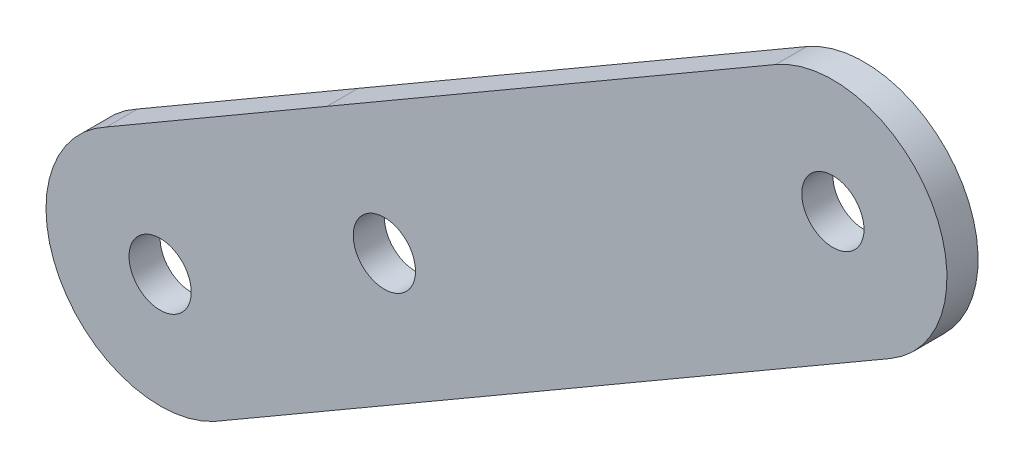
ISO-10303-21;
HEADER;
FILE_DESCRIPTION(('STEP AP214'),'2;1');
FILE_NAME('part.step','',(''),(''),'','','');
FILE_SCHEMA(('AUTOMOTIVE_DESIGN { 1 0 10303 214 1 1 1 1 }'));
ENDSEC;
DATA;
#1=APPLICATION_CONTEXT('core data for automotive mechanical design processes');
#2=APPLICATION_PROTOCOL_DEFINITION('international standard','automotive_design',2000,#1);
#3=PRODUCT_CONTEXT('',#1,'mechanical');
#4=PRODUCT('Part','Part','',(#3));
#5=PRODUCT_RELATED_PRODUCT_CATEGORY('part','',(#4));
#6=PRODUCT_DEFINITION_FORMATION('','',#4);
#7=PRODUCT_DEFINITION_CONTEXT('part definition',#1,'design');
#8=PRODUCT_DEFINITION('design','',#6,#7);
#9=PRODUCT_DEFINITION_SHAPE('','',#8);
#10=(LENGTH_UNIT() NAMED_UNIT(*) SI_UNIT(.MILLI.,.METRE.));
#11=(NAMED_UNIT(*) PLANE_ANGLE_UNIT() SI_UNIT($,.RADIAN.));
#12=(NAMED_UNIT(*) SI_UNIT($,.STERADIAN.) SOLID_ANGLE_UNIT());
#13=UNCERTAINTY_MEASURE_WITH_UNIT(LENGTH_MEASURE(1.E-05),#10,'distance_accuracy_value','');
#14=(GEOMETRIC_REPRESENTATION_CONTEXT(3) GLOBAL_UNCERTAINTY_ASSIGNED_CONTEXT((#13)) GLOBAL_UNIT_ASSIGNED_CONTEXT((#10,
#11,#12)) REPRESENTATION_CONTEXT('',''));
#15=CARTESIAN_POINT('',(0.,0.,0.));
#16=DIRECTION('',(0.,0.,1.));
#17=DIRECTION('',(1.,0.,0.));
#18=AXIS2_PLACEMENT_3D('',#15,#16,#17);
#19=CARTESIAN_POINT('',(72.6611774632217,-125.128113418005,3.));
#20=DIRECTION('',(-0.502167271742929,0.86477050781711,0.));
#21=DIRECTION('',(-0.86477050781711,-0.50216727174293,0.));
#22=AXIS2_PLACEMENT_3D('',#19,#20,#21);
#23=PLANE('',#22);
#24=DIRECTION('',(0.86477050781711,0.50216727174293,0.));
#25=VECTOR('',#24,1.);
#26=CARTESIAN_POINT('',(72.6611774632217,-125.128113418005,0.));
#27=LINE('',#26,#25);
#28=CARTESIAN_POINT('',(173.688379763338,-66.4621967473133,0.));
#29=VERTEX_POINT('',#28);
#30=CARTESIAN_POINT('',(216.929531332778,-41.352308153332,0.));
#31=VERTEX_POINT('',#30);
#32=EDGE_CURVE('E133',#29,#31,#27,.T.);
#33=ORIENTED_EDGE('',*,*,#32,.T.);
#34=DIRECTION('',(0.,0.,-1.));
#35=VECTOR('',#34,1.);
#36=CARTESIAN_POINT('',(216.929531332778,-41.352308153332,3.));
#37=LINE('',#36,#35);
#38=CARTESIAN_POINT('',(216.929531332778,-41.352308153332,3.));
#39=VERTEX_POINT('',#38);
#40=EDGE_CURVE('E11',#39,#31,#37,.T.);
#41=ORIENTED_EDGE('',*,*,#40,.F.);
#42=DIRECTION('',(0.86477050781711,0.50216727174293,0.));
#43=VECTOR('',#42,1.);
#44=CARTESIAN_POINT('',(72.6611774632217,-125.128113418005,3.));
#45=LINE('',#44,#43);
#46=CARTESIAN_POINT('',(173.688379763338,-66.4621967473133,3.));
#47=VERTEX_POINT('',#46);
#48=EDGE_CURVE('E158',#47,#39,#45,.T.);
#49=ORIENTED_EDGE('',*,*,#48,.F.);
#50=DIRECTION('',(0.,0.,-1.));
#51=VECTOR('',#50,1.);
#52=CARTESIAN_POINT('',(173.688379763338,-66.4621967473133,3.));
#53=LINE('',#52,#51);
#54=EDGE_CURVE('E123',#47,#29,#53,.T.);
#55=ORIENTED_EDGE('',*,*,#54,.T.);
#56=EDGE_LOOP('',(#33,#41,#49,#55));
#57=FACE_BOUND('',#56,.T.);
#58=ADVANCED_FACE('F39',(#57),#23,.F.);
#59=CARTESIAN_POINT('',(211.405691084948,-31.839832121915,3.));
#60=DIRECTION('',(0.,0.,-1.));
#61=DIRECTION('',(-1.,0.,0.));
#62=AXIS2_PLACEMENT_3D('',#59,#60,#61);
#63=CYLINDRICAL_SURFACE('',#62,11.0000005150832);
#64=CARTESIAN_POINT('',(211.405691084948,-31.839832121915,0.));
#65=DIRECTION('',(0.,0.,1.));
#66=DIRECTION('',(1.,0.,0.));
#67=AXIS2_PLACEMENT_3D('',#64,#65,#66);
#68=CIRCLE('',#67,11.0000005150832);
#69=CARTESIAN_POINT('',(205.881850837118,-22.327356090498,0.));
#70=VERTEX_POINT('',#69);
#71=EDGE_CURVE('E136',#31,#70,#68,.T.);
#72=ORIENTED_EDGE('',*,*,#71,.T.);
#73=DIRECTION('',(0.,0.,-1.));
#74=VECTOR('',#73,1.);
#75=CARTESIAN_POINT('',(205.881850837118,-22.327356090498,3.));
#76=LINE('',#75,#74);
#77=CARTESIAN_POINT('',(205.881850837118,-22.327356090498,3.));
#78=VERTEX_POINT('',#77);
#79=EDGE_CURVE('E48',#78,#70,#76,.T.);
#80=ORIENTED_EDGE('',*,*,#79,.F.);
#81=CARTESIAN_POINT('',(211.405691084948,-31.839832121915,3.));
#82=DIRECTION('',(0.,0.,1.));
#83=DIRECTION('',(1.,0.,0.));
#84=AXIS2_PLACEMENT_3D('',#81,#82,#83);
#85=CIRCLE('',#84,11.0000005150832);
#86=EDGE_CURVE('E92',#39,#78,#85,.T.);
#87=ORIENTED_EDGE('',*,*,#86,.F.);
#88=ORIENTED_EDGE('',*,*,#40,.T.);
#89=EDGE_LOOP('',(#72,#80,#87,#88));
#90=FACE_BOUND('',#89,.T.);
#91=ADVANCED_FACE('F151',(#90),#63,.T.);
#92=CARTESIAN_POINT('',(61.6134969675615,-106.103161355171,3.));
#93=DIRECTION('',(-0.50216727174293,0.86477050781711,0.));
#94=DIRECTION('',(-0.86477050781711,-0.50216727174293,0.));
#95=AXIS2_PLACEMENT_3D('',#92,#93,#94);
#96=PLANE('',#95);
#97=DIRECTION('',(0.86477050781711,0.50216727174293,0.));
#98=VECTOR('',#97,1.);
#99=CARTESIAN_POINT('',(61.6134969675615,-106.103161355171,0.));
#100=LINE('',#99,#98);
#101=CARTESIAN_POINT('',(162.640616578186,-47.4372927017925,0.));
#102=VERTEX_POINT('',#101);
#103=EDGE_CURVE('E139',#102,#70,#100,.T.);
#104=ORIENTED_EDGE('',*,*,#103,.F.);
#105=DIRECTION('',(0.,0.,-1.));
#106=VECTOR('',#105,1.);
#107=CARTESIAN_POINT('',(162.640616578186,-47.4372927017925,3.));
#108=LINE('',#107,#106);
#109=CARTESIAN_POINT('',(162.640616578186,-47.4372927017925,3.));
#110=VERTEX_POINT('',#109);
#111=EDGE_CURVE('E108',#110,#102,#108,.T.);
#112=ORIENTED_EDGE('',*,*,#111,.F.);
#113=DIRECTION('',(0.86477050781711,0.50216727174293,0.));
#114=VECTOR('',#113,1.);
#115=CARTESIAN_POINT('',(61.6134969675615,-106.103161355171,3.));
#116=LINE('',#115,#114);
#117=EDGE_CURVE('E117',#110,#78,#116,.T.);
#118=ORIENTED_EDGE('',*,*,#117,.T.);
#119=ORIENTED_EDGE('',*,*,#79,.T.);
#120=EDGE_LOOP('',(#104,#112,#118,#119));
#121=FACE_BOUND('',#120,.T.);
#122=ADVANCED_FACE('F150',(#121),#96,.T.);
#123=CARTESIAN_POINT('',(61.660434185085,-106.11437485163,3.));
#124=DIRECTION('',(-0.502413578957616,0.864627431717846,0.));
#125=DIRECTION('',(-0.864627431717847,-0.502413578957616,0.));
#126=AXIS2_PLACEMENT_3D('',#123,#124,#125);
#127=PLANE('',#126);
#128=DIRECTION('',(0.864627431717847,0.502413578957616,0.));
#129=VECTOR('',#128,1.);
#130=CARTESIAN_POINT('',(61.660434185085,-106.11437485163,0.));
#131=LINE('',#130,#129);
#132=CARTESIAN_POINT('',(141.367093536746,-59.7988098781007,0.));
#133=VERTEX_POINT('',#132);
#134=EDGE_CURVE('E107',#133,#102,#131,.T.);
#135=ORIENTED_EDGE('',*,*,#134,.F.);
#136=DIRECTION('',(0.,0.,-1.));
#137=VECTOR('',#136,1.);
#138=CARTESIAN_POINT('',(141.367093536746,-59.7988098781007,3.));
#139=LINE('',#138,#137);
#140=CARTESIAN_POINT('',(141.367093536746,-59.7988098781007,3.));
#141=VERTEX_POINT('',#140);
#142=EDGE_CURVE('E101',#141,#133,#139,.T.);
#143=ORIENTED_EDGE('',*,*,#142,.F.);
#144=DIRECTION('',(0.864627431717847,0.502413578957616,0.));
#145=VECTOR('',#144,1.);
#146=CARTESIAN_POINT('',(61.660434185085,-106.11437485163,3.));
#147=LINE('',#146,#145);
#148=EDGE_CURVE('E105',#141,#110,#147,.T.);
#149=ORIENTED_EDGE('',*,*,#148,.T.);
#150=ORIENTED_EDGE('',*,*,#111,.T.);
#151=EDGE_LOOP('',(#135,#143,#149,#150));
#152=FACE_BOUND('',#151,.T.);
#153=ADVANCED_FACE('F103',(#152),#127,.T.);
#154=CARTESIAN_POINT('',(146.547902740009,-69.5023770572045,3.));
#155=DIRECTION('',(0.,0.,-1.));
#156=DIRECTION('',(-1.,0.,0.));
#157=AXIS2_PLACEMENT_3D('',#154,#155,#156);
#158=CYLINDRICAL_SURFACE('',#157,11.);
#159=CARTESIAN_POINT('',(146.547902740009,-69.5023770572045,0.));
#160=DIRECTION('',(0.,0.,1.));
#161=DIRECTION('',(1.,0.,0.));
#162=AXIS2_PLACEMENT_3D('',#159,#160,#161);
#163=CIRCLE('',#162,11.);
#164=CARTESIAN_POINT('',(151.728711943273,-79.2059442363084,0.));
#165=VERTEX_POINT('',#164);
#166=EDGE_CURVE('E78',#133,#165,#163,.T.);
#167=ORIENTED_EDGE('',*,*,#166,.T.);
#168=DIRECTION('',(0.,0.,-1.));
#169=VECTOR('',#168,1.);
#170=CARTESIAN_POINT('',(151.728711943273,-79.2059442363084,3.));
#171=LINE('',#170,#169);
#172=CARTESIAN_POINT('',(151.728711943273,-79.2059442363084,3.));
#173=VERTEX_POINT('',#172);
#174=EDGE_CURVE('E109',#173,#165,#171,.T.);
#175=ORIENTED_EDGE('',*,*,#174,.F.);
#176=CARTESIAN_POINT('',(146.547902740009,-69.5023770572045,3.));
#177=DIRECTION('',(0.,0.,1.));
#178=DIRECTION('',(1.,0.,0.));
#179=AXIS2_PLACEMENT_3D('',#176,#177,#178);
#180=CIRCLE('',#179,11.);
#181=EDGE_CURVE('E111',#141,#173,#180,.T.);
#182=ORIENTED_EDGE('',*,*,#181,.F.);
#183=ORIENTED_EDGE('',*,*,#142,.T.);
#184=EDGE_LOOP('',(#167,#175,#182,#183));
#185=FACE_BOUND('',#184,.T.);
#186=ADVANCED_FACE('F112',(#185),#158,.T.);
#187=CARTESIAN_POINT('',(168.167159932992,-56.9481857880032,3.));
#188=DIRECTION('',(0.,0.,-1.));
#189=DIRECTION('',(-1.,0.,0.));
#190=AXIS2_PLACEMENT_3D('',#187,#188,#189);
#191=CYLINDRICAL_SURFACE('',#190,2.99999999999999);
#192=CARTESIAN_POINT('',(168.167159932992,-56.9481857880032,3.));
#193=DIRECTION('',(0.,0.,1.));
#194=DIRECTION('',(1.,0.,0.));
#195=AXIS2_PLACEMENT_3D('',#192,#193,#194);
#196=CIRCLE('',#195,2.99999999999999);
#197=CARTESIAN_POINT('',(171.167159932992,-56.9481857880032,3.));
#198=VERTEX_POINT('',#197);
#199=EDGE_CURVE('E287',#198,#198,#196,.T.);
#200=ORIENTED_EDGE('',*,*,#199,.T.);
#201=EDGE_LOOP('',(#200));
#202=FACE_BOUND('',#201,.T.);
#203=CARTESIAN_POINT('',(168.167159932992,-56.9481857880032,0.));
#204=DIRECTION('',(0.,0.,1.));
#205=DIRECTION('',(1.,0.,0.));
#206=AXIS2_PLACEMENT_3D('',#203,#204,#205);
#207=CIRCLE('',#206,2.99999999999999);
#208=CARTESIAN_POINT('',(171.167159932992,-56.9481857880032,0.));
#209=VERTEX_POINT('',#208);
#210=EDGE_CURVE('E130',#209,#209,#207,.T.);
#211=ORIENTED_EDGE('',*,*,#210,.F.);
#212=EDGE_LOOP('',(#211));
#213=FACE_BOUND('',#212,.T.);
#214=ADVANCED_FACE('F180',(#202,#213),#191,.F.);
#215=CARTESIAN_POINT('',(146.547901788208,-69.5023754181295,3.));
#216=DIRECTION('',(0.,0.,-1.));
#217=DIRECTION('',(-1.,0.,0.));
#218=AXIS2_PLACEMENT_3D('',#215,#216,#217);
#219=CYLINDRICAL_SURFACE('',#218,3.00000000000002);
#220=CARTESIAN_POINT('',(146.547901788208,-69.5023754181295,3.));
#221=DIRECTION('',(0.,0.,1.));
#222=DIRECTION('',(1.,0.,0.));
#223=AXIS2_PLACEMENT_3D('',#220,#221,#222);
#224=CIRCLE('',#223,3.00000000000002);
#225=CARTESIAN_POINT('',(149.547901788208,-69.5023754181295,3.));
#226=VERTEX_POINT('',#225);
#227=EDGE_CURVE('E190',#226,#226,#224,.T.);
#228=ORIENTED_EDGE('',*,*,#227,.T.);
#229=EDGE_LOOP('',(#228));
#230=FACE_BOUND('',#229,.T.);
#231=CARTESIAN_POINT('',(146.547901788208,-69.5023754181295,0.));
#232=DIRECTION('',(0.,0.,1.));
#233=DIRECTION('',(1.,0.,0.));
#234=AXIS2_PLACEMENT_3D('',#231,#232,#233);
#235=CIRCLE('',#234,3.00000000000002);
#236=CARTESIAN_POINT('',(149.547901788208,-69.5023754181295,0.));
#237=VERTEX_POINT('',#236);
#238=EDGE_CURVE('E127',#237,#237,#235,.T.);
#239=ORIENTED_EDGE('',*,*,#238,.F.);
#240=EDGE_LOOP('',(#239));
#241=FACE_BOUND('',#240,.T.);
#242=ADVANCED_FACE('F168',(#230,#241),#219,.F.);
#243=CARTESIAN_POINT('',(211.405691084948,-31.839832121915,3.));
#244=DIRECTION('',(0.,0.,-1.));
#245=DIRECTION('',(-1.,0.,0.));
#246=AXIS2_PLACEMENT_3D('',#243,#244,#245);
#247=CYLINDRICAL_SURFACE('',#246,2.99999999999999);
#248=CARTESIAN_POINT('',(211.405691084948,-31.839832121915,3.));
#249=DIRECTION('',(0.,0.,1.));
#250=DIRECTION('',(1.,0.,0.));
#251=AXIS2_PLACEMENT_3D('',#248,#249,#250);
#252=CIRCLE('',#251,2.99999999999999);
#253=CARTESIAN_POINT('',(214.405691084948,-31.839832121915,3.));
#254=VERTEX_POINT('',#253);
#255=EDGE_CURVE('E145',#254,#254,#252,.T.);
#256=ORIENTED_EDGE('',*,*,#255,.T.);
#257=EDGE_LOOP('',(#256));
#258=FACE_BOUND('',#257,.T.);
#259=CARTESIAN_POINT('',(211.405691084948,-31.839832121915,0.));
#260=DIRECTION('',(0.,0.,1.));
#261=DIRECTION('',(1.,0.,0.));
#262=AXIS2_PLACEMENT_3D('',#259,#260,#261);
#263=CIRCLE('',#262,2.99999999999999);
#264=CARTESIAN_POINT('',(214.405691084948,-31.839832121915,0.));
#265=VERTEX_POINT('',#264);
#266=EDGE_CURVE('E124',#265,#265,#263,.T.);
#267=ORIENTED_EDGE('',*,*,#266,.F.);
#268=EDGE_LOOP('',(#267));
#269=FACE_BOUND('',#268,.T.);
#270=ADVANCED_FACE('F41',(#258,#269),#247,.F.);
#271=CARTESIAN_POINT('',(72.6104382173944,-125.120268186441,3.));
#272=DIRECTION('',(-0.5019285088625,0.864909111982911,0.));
#273=DIRECTION('',(-0.864909111982911,-0.5019285088625,0.));
#274=AXIS2_PLACEMENT_3D('',#271,#272,#273);
#275=PLANE('',#274);
#276=DIRECTION('',(0.864909111982911,0.5019285088625,0.));
#277=VECTOR('',#276,1.);
#278=CARTESIAN_POINT('',(72.6104382173944,-125.120268186441,0.));
#279=LINE('',#278,#277);
#280=EDGE_CURVE('E84',#165,#29,#279,.T.);
#281=ORIENTED_EDGE('',*,*,#280,.T.);
#282=ORIENTED_EDGE('',*,*,#54,.F.);
#283=DIRECTION('',(0.864909111982911,0.5019285088625,0.));
#284=VECTOR('',#283,1.);
#285=CARTESIAN_POINT('',(72.6104382173944,-125.120268186441,3.));
#286=LINE('',#285,#284);
#287=EDGE_CURVE('E56',#173,#47,#286,.T.);
#288=ORIENTED_EDGE('',*,*,#287,.F.);
#289=ORIENTED_EDGE('',*,*,#174,.T.);
#290=EDGE_LOOP('',(#281,#282,#288,#289));
#291=FACE_BOUND('',#290,.T.);
#292=ADVANCED_FACE('F159',(#291),#275,.F.);
#293=CARTESIAN_POINT('',(0.,0.,3.));
#294=DIRECTION('',(0.,0.,1.));
#295=DIRECTION('',(1.,0.,0.));
#296=AXIS2_PLACEMENT_3D('',#293,#294,#295);
#297=PLANE('',#296);
#298=ORIENTED_EDGE('',*,*,#255,.F.);
#299=EDGE_LOOP('',(#298));
#300=FACE_BOUND('',#299,.T.);
#301=ORIENTED_EDGE('',*,*,#227,.F.);
#302=EDGE_LOOP('',(#301));
#303=FACE_BOUND('',#302,.T.);
#304=ORIENTED_EDGE('',*,*,#199,.F.);
#305=EDGE_LOOP('',(#304));
#306=FACE_BOUND('',#305,.T.);
#307=ORIENTED_EDGE('',*,*,#48,.T.);
#308=ORIENTED_EDGE('',*,*,#86,.T.);
#309=ORIENTED_EDGE('',*,*,#117,.F.);
#310=ORIENTED_EDGE('',*,*,#148,.F.);
#311=ORIENTED_EDGE('',*,*,#181,.T.);
#312=ORIENTED_EDGE('',*,*,#287,.T.);
#313=EDGE_LOOP('',(#307,#308,#309,#310,#311,#312));
#314=FACE_BOUND('',#313,.T.);
#315=ADVANCED_FACE('F115',(#300,#303,#306,#314),#297,.T.);
#316=CARTESIAN_POINT('',(0.,0.,0.));
#317=DIRECTION('',(0.,0.,1.));
#318=DIRECTION('',(1.,0.,0.));
#319=AXIS2_PLACEMENT_3D('',#316,#317,#318);
#320=PLANE('',#319);
#321=ORIENTED_EDGE('',*,*,#266,.T.);
#322=EDGE_LOOP('',(#321));
#323=FACE_BOUND('',#322,.T.);
#324=ORIENTED_EDGE('',*,*,#238,.T.);
#325=EDGE_LOOP('',(#324));
#326=FACE_BOUND('',#325,.T.);
#327=ORIENTED_EDGE('',*,*,#210,.T.);
#328=EDGE_LOOP('',(#327));
#329=FACE_BOUND('',#328,.T.);
#330=ORIENTED_EDGE('',*,*,#32,.F.);
#331=ORIENTED_EDGE('',*,*,#280,.F.);
#332=ORIENTED_EDGE('',*,*,#166,.F.);
#333=ORIENTED_EDGE('',*,*,#134,.T.);
#334=ORIENTED_EDGE('',*,*,#103,.T.);
#335=ORIENTED_EDGE('',*,*,#71,.F.);
#336=EDGE_LOOP('',(#330,#331,#332,#333,#334,#335));
#337=FACE_BOUND('',#336,.T.);
#338=ADVANCED_FACE('F155',(#323,#326,#329,#337),#320,.F.);
#339=CLOSED_SHELL('',(#58,#91,#122,#153,#186,#214,#242,#270,#292,#315,#338));
#340=MANIFOLD_SOLID_BREP('B2',#339);
#341=ADVANCED_BREP_SHAPE_REPRESENTATION('',(#18,#340),#14);
#342=SHAPE_DEFINITION_REPRESENTATION(#9,#341);
ENDSEC;
END-ISO-10303-21;
